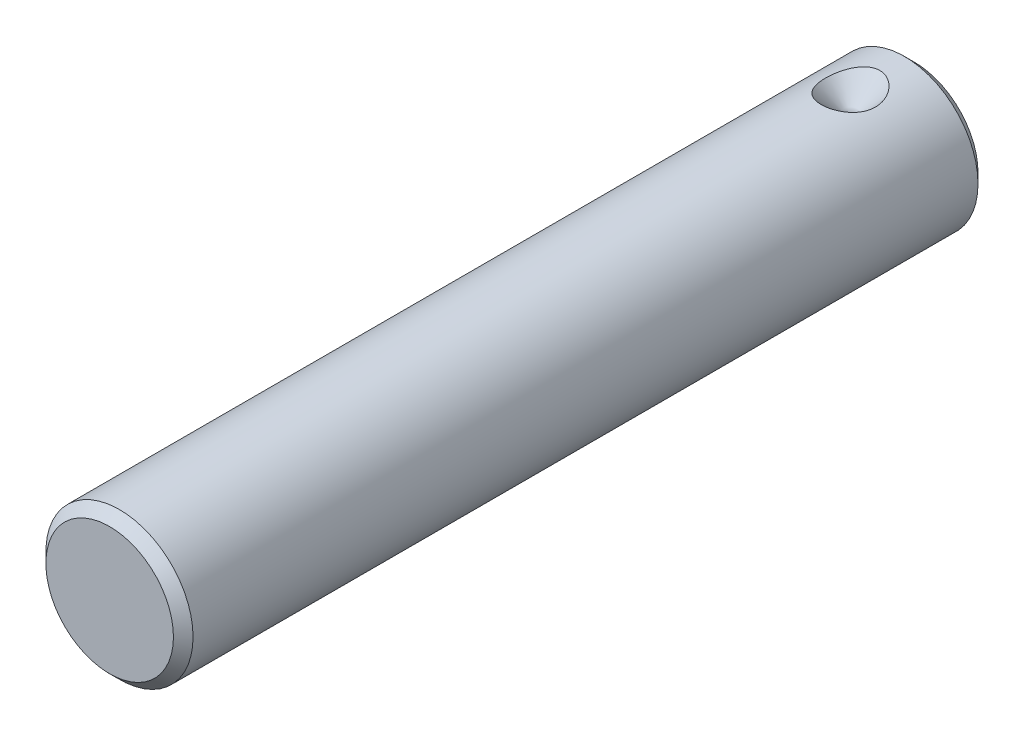
ISO-10303-21;
HEADER;
FILE_DESCRIPTION(('STEP AP214'),'2;1');
FILE_NAME('part.step','',(''),(''),'','','');
FILE_SCHEMA(('AUTOMOTIVE_DESIGN { 1 0 10303 214 1 1 1 1 }'));
ENDSEC;
DATA;
#1=APPLICATION_CONTEXT('core data for automotive mechanical design processes');
#2=APPLICATION_PROTOCOL_DEFINITION('international standard','automotive_design',2000,#1);
#3=PRODUCT_CONTEXT('',#1,'mechanical');
#4=PRODUCT('Part','Part','',(#3));
#5=PRODUCT_RELATED_PRODUCT_CATEGORY('part','',(#4));
#6=PRODUCT_DEFINITION_FORMATION('','',#4);
#7=PRODUCT_DEFINITION_CONTEXT('part definition',#1,'design');
#8=PRODUCT_DEFINITION('design','',#6,#7);
#9=PRODUCT_DEFINITION_SHAPE('','',#8);
#10=(LENGTH_UNIT() NAMED_UNIT(*) SI_UNIT(.MILLI.,.METRE.));
#11=(NAMED_UNIT(*) PLANE_ANGLE_UNIT() SI_UNIT($,.RADIAN.));
#12=(NAMED_UNIT(*) SI_UNIT($,.STERADIAN.) SOLID_ANGLE_UNIT());
#13=UNCERTAINTY_MEASURE_WITH_UNIT(LENGTH_MEASURE(1.E-05),#10,'distance_accuracy_value','');
#14=(GEOMETRIC_REPRESENTATION_CONTEXT(3) GLOBAL_UNCERTAINTY_ASSIGNED_CONTEXT((#13)) GLOBAL_UNIT_ASSIGNED_CONTEXT((#10,
#11,#12)) REPRESENTATION_CONTEXT('',''));
#15=CARTESIAN_POINT('',(0.,0.,0.));
#16=DIRECTION('',(0.,0.,1.));
#17=DIRECTION('',(1.,0.,0.));
#18=AXIS2_PLACEMENT_3D('',#15,#16,#17);
#19=CARTESIAN_POINT('',(0.,0.,82.));
#20=DIRECTION('',(0.,0.,-1.));
#21=DIRECTION('',(-1.,0.,0.));
#22=AXIS2_PLACEMENT_3D('',#19,#20,#21);
#23=CYLINDRICAL_SURFACE('',#22,7.5);
#24=CARTESIAN_POINT('',(0.,0.,81.));
#25=DIRECTION('',(0.,0.,1.));
#26=DIRECTION('',(1.,0.,0.));
#27=AXIS2_PLACEMENT_3D('',#24,#25,#26);
#28=CIRCLE('',#27,7.5);
#29=CARTESIAN_POINT('',(7.5,0.,81.));
#30=VERTEX_POINT('',#29);
#31=EDGE_CURVE('E49',#30,#30,#28,.F.);
#32=ORIENTED_EDGE('',*,*,#31,.T.);
#33=EDGE_LOOP('',(#32));
#34=FACE_BOUND('',#33,.T.);
#35=CARTESIAN_POINT('',(0.,0.,1.00000000000003));
#36=DIRECTION('',(0.,0.,1.));
#37=DIRECTION('',(1.,0.,0.));
#38=AXIS2_PLACEMENT_3D('',#35,#36,#37);
#39=CIRCLE('',#38,7.5);
#40=CARTESIAN_POINT('',(7.5,0.,1.00000000000003));
#41=VERTEX_POINT('',#40);
#42=EDGE_CURVE('E65',#41,#41,#39,.T.);
#43=ORIENTED_EDGE('',*,*,#42,.T.);
#44=EDGE_LOOP('',(#43));
#45=FACE_BOUND('',#44,.T.);
#46=CARTESIAN_POINT('',(-1.47707902909699,7.35311087601103,4.0590005879587));
#47=CARTESIAN_POINT('',(-1.5839328256194,7.33164667120942,4.14874921443851));
#48=CARTESIAN_POINT('',(-1.68352324734299,7.30921795473535,4.24692007223599));
#49=CARTESIAN_POINT('',(-1.86738415363234,7.26442458128592,4.45697146156353));
#50=CARTESIAN_POINT('',(-1.95161860031434,7.2420601932186,4.5688832372067));
#51=CARTESIAN_POINT('',(-2.1152247878205,7.1961157391603,4.82072235266105));
#52=CARTESIAN_POINT('',(-2.19206857483794,7.17283895915137,4.96235084194592));
#53=CARTESIAN_POINT('',(-2.32401608151441,7.13118073513076,5.25599420179921));
#54=CARTESIAN_POINT('',(-2.37911972856451,7.11279930746893,5.40800910705478));
#55=CARTESIAN_POINT('',(-2.47187373309358,7.08113938689317,5.73587758758487));
#56=CARTESIAN_POINT('',(-2.50698721092675,7.06862925418301,5.9125298060256));
#57=CARTESIAN_POINT('',(-2.54937168208692,7.0534539754866,6.26956350065951));
#58=CARTESIAN_POINT('',(-2.55663847760463,7.05079031383039,6.44994553499167));
#59=CARTESIAN_POINT('',(-2.54305972628458,7.05570033895164,6.81337824683152));
#60=CARTESIAN_POINT('',(-2.52161153200252,7.06349349282575,6.99640383043065));
#61=CARTESIAN_POINT('',(-2.44987667885987,7.08869026009067,7.35611323635118));
#62=CARTESIAN_POINT('',(-2.39957726294301,7.10609812466232,7.53279421655253));
#63=CARTESIAN_POINT('',(-2.27079854089685,7.14829031683831,7.87473309924741));
#64=CARTESIAN_POINT('',(-2.19230736509927,7.17307775073341,8.03998615520299));
#65=CARTESIAN_POINT('',(-2.00793372060204,7.22685193213562,8.35371616614124));
#66=CARTESIAN_POINT('',(-1.90206979718897,7.25583583067181,8.50220438197987));
#67=CARTESIAN_POINT('',(-1.68786218808685,7.30826365516269,8.74901362798377));
#68=CARTESIAN_POINT('',(-1.58422042015873,7.33166007495115,8.85143440105054));
#69=CARTESIAN_POINT('',(-1.3611649029259,7.37632093616283,9.03791654325617));
#70=CARTESIAN_POINT('',(-1.24177164064004,7.39758808486041,9.12200139026678));
#71=CARTESIAN_POINT('',(-1.00813520863509,7.4327283325386,9.2567505231733));
#72=CARTESIAN_POINT('',(-0.895789123729619,7.44723146681885,9.31053147355728));
#73=CARTESIAN_POINT('',(-0.663350189449545,7.47151796620175,9.39916899842798));
#74=CARTESIAN_POINT('',(-0.543261577029299,7.48130388827034,9.43403582660666));
#75=CARTESIAN_POINT('',(-0.298005133691314,7.49508654560496,9.48284791097122));
#76=CARTESIAN_POINT('',(-0.172818199734215,7.49905895409091,9.49670526116194));
#77=CARTESIAN_POINT('',(0.0780832391678082,7.50064188596071,9.50224760244724));
#78=CARTESIAN_POINT('',(0.203797659762059,7.49825339050643,9.49393601307411));
#79=CARTESIAN_POINT('',(0.442709220279822,7.4878101969206,9.45711964971857));
#80=CARTESIAN_POINT('',(0.55615922758477,7.48017221931012,9.43009896010601));
#81=CARTESIAN_POINT('',(0.777127900854823,7.46045512492648,9.35897684513193));
#82=CARTESIAN_POINT('',(0.884645499065353,7.44837521164347,9.31487235629712));
#83=CARTESIAN_POINT('',(1.09754094430353,7.42008043999124,9.2086909349686));
#84=CARTESIAN_POINT('',(1.20245230612844,7.4036700615479,9.14573720500599));
#85=CARTESIAN_POINT('',(1.40180793913712,7.36852776390022,9.00558265762189));
#86=CARTESIAN_POINT('',(1.49624735168006,7.34979477554801,8.92837527087564));
#87=CARTESIAN_POINT('',(1.68769937027426,7.30840049953437,8.749018226706));
#88=CARTESIAN_POINT('',(1.78279067066659,7.28558403515414,8.64485578394017));
#89=CARTESIAN_POINT('',(1.95701642005785,7.240731497048,8.42380570579143));
#90=CARTESIAN_POINT('',(2.03614044981169,7.21869594057442,8.30690983747098));
#91=CARTESIAN_POINT('',(2.18975373564369,7.17373179050396,8.04281038979401));
#92=CARTESIAN_POINT('',(2.26128286582492,7.15126432903633,7.89379978800494));
#93=CARTESIAN_POINT('',(2.3813595316026,7.11218096212165,7.58606470760648));
#94=CARTESIAN_POINT('',(2.42989793273174,7.09556738315618,7.42733639628138));
#95=CARTESIAN_POINT('',(2.50677767894322,7.06879821567171,7.08927866933224));
#96=CARTESIAN_POINT('',(2.53290147796754,7.05936058787964,6.90938269307804));
#97=CARTESIAN_POINT('',(2.55675222378239,7.05075724281847,6.54748647905903));
#98=CARTESIAN_POINT('',(2.55447814633962,7.05159189604228,6.3654861656331));
#99=CARTESIAN_POINT('',(2.52135894331537,7.0635020767204,6.00200298220532));
#100=CARTESIAN_POINT('',(2.49013622948599,7.07471294173772,5.82055881239887));
#101=CARTESIAN_POINT('',(2.39904529445963,7.10611580710497,5.46570533248325));
#102=CARTESIAN_POINT('',(2.33916131951874,7.12631274624588,5.2923004987822));
#103=CARTESIAN_POINT('',(2.19154575026068,7.17308211739379,4.95883076275272));
#104=CARTESIAN_POINT('',(2.10383493885111,7.19964978771644,4.79875601692379));
#105=CARTESIAN_POINT('',(1.90140500774026,7.25573166919009,4.49729475053969));
#106=CARTESIAN_POINT('',(1.78671613669458,7.28524255911779,4.35588757454206));
#107=CARTESIAN_POINT('',(1.56079833763191,7.33648940705849,4.12751329029175));
#108=CARTESIAN_POINT('',(1.45473201738479,7.35846517764632,4.0354826014292));
#109=CARTESIAN_POINT('',(1.22850073142113,7.39959235298263,3.86986445814121));
#110=CARTESIAN_POINT('',(1.10834433185379,7.41874545796581,3.79626588227799));
#111=CARTESIAN_POINT('',(0.855128586934648,7.45219178915853,3.67086149879204));
#112=CARTESIAN_POINT('',(0.72197112840568,7.46644369262184,3.61924015804343));
#113=CARTESIAN_POINT('',(0.447701872275129,7.48788227961751,3.54244989975568));
#114=CARTESIAN_POINT('',(0.306599441299024,7.49507710593771,3.51725049302277));
#115=CARTESIAN_POINT('',(0.0420867815793008,7.50088236758279,3.49690453574446));
#116=CARTESIAN_POINT('',(-0.0810243592926614,7.50055671626989,3.49803358221662));
#117=CARTESIAN_POINT('',(-0.325102956936017,7.49394429581899,3.5212387877133));
#118=CARTESIAN_POINT('',(-0.446070195824481,7.48765692429534,3.54331706349529));
#119=CARTESIAN_POINT('',(-0.676793917568801,7.4702574509108,3.60553350341213));
#120=CARTESIAN_POINT('',(-0.786810138597894,7.45938146634656,3.64479093917722));
#121=CARTESIAN_POINT('',(-0.999229592428384,7.43390769610132,3.7390787882294));
#122=CARTESIAN_POINT('',(-1.10163886181526,7.41931290317107,3.79409652265013));
#123=CARTESIAN_POINT('',(-1.29664679557317,7.38772009435093,3.91724970950402));
#124=CARTESIAN_POINT('',(-1.38931299903704,7.37074083493754,3.98528415573241));
#125=CARTESIAN_POINT('',(-1.47707902909699,7.35311087601103,4.0590005879587));
#126=B_SPLINE_CURVE_WITH_KNOTS('',3,(#46,#47,#48,#49,#50,#51,#52,#53,#54,#55,#56,#57,#58,#59,
#60,#61,#62,#63,#64,#65,#66,#67,#68,#69,#70,#71,#72,#73,#74,#75,#76,#77,#78,#79,#80,#81,#82,#83,
#84,#85,#86,#87,#88,#89,#90,#91,#92,#93,#94,#95,#96,#97,#98,#99,#100,#101,#102,#103,#104,#105,
#106,#107,#108,#109,#110,#111,#112,#113,#114,#115,#116,#117,#118,#119,#120,#121,#122,#123,#124,
#125),.UNSPECIFIED.,.T.,.F.,(4,2,2,2,2,2,2,2,2,2,2,2,2,2,2,2,2,2,2,2,2,2,2,2,2,2,2,2,2,2,2,2,2,
2,2,2,2,2,2,4),(0.,0.423202686522097,0.847386119755746,1.33382299561528,1.82026149608995,
2.359387638127,2.89859504872214,3.44929815715319,4.00024495620769,4.55142399462757,
5.10223057825516,5.54322770543553,5.98365680711813,6.35826260383001,6.73266511641345,
7.10862988901607,7.48453667285808,7.83360513932451,8.18273622987919,8.55165096910118,
8.92073616272594,9.3477331020993,9.77500777842934,10.2733538781466,10.7718978104633,
11.3154252341155,11.8589722613637,12.4097102502906,12.9607513021787,13.5113817654819,
14.0613977627633,14.486128553066,14.9106024515237,15.3385721199243,15.766047393823,
16.1334731979299,16.5009361315244,16.8514362313417,17.2016551484553,17.5492592665641),.UNSPECIFIED.);
#127=CARTESIAN_POINT('',(-1.47707902909699,7.35311087601103,4.0590005879587));
#128=VERTEX_POINT('',#127);
#129=EDGE_CURVE('E60',#128,#128,#126,.T.);
#130=ORIENTED_EDGE('',*,*,#129,.F.);
#131=EDGE_LOOP('',(#130));
#132=FACE_BOUND('',#131,.T.);
#133=ADVANCED_FACE('F41',(#34,#45,#132),#23,.T.);
#134=CARTESIAN_POINT('',(0.,0.,82.));
#135=DIRECTION('',(0.,0.,1.));
#136=DIRECTION('',(1.,0.,0.));
#137=AXIS2_PLACEMENT_3D('',#134,#135,#136);
#138=PLANE('',#137);
#139=CARTESIAN_POINT('',(0.,0.,82.));
#140=DIRECTION('',(0.,0.,1.));
#141=DIRECTION('',(1.,0.,0.));
#142=AXIS2_PLACEMENT_3D('',#139,#140,#141);
#143=CIRCLE('',#142,6.5);
#144=CARTESIAN_POINT('',(6.5,0.,82.));
#145=VERTEX_POINT('',#144);
#146=EDGE_CURVE('E62',#145,#145,#143,.T.);
#147=ORIENTED_EDGE('',*,*,#146,.T.);
#148=EDGE_LOOP('',(#147));
#149=FACE_BOUND('',#148,.T.);
#150=ADVANCED_FACE('F76',(#149),#138,.T.);
#151=CARTESIAN_POINT('',(0.,0.,0.));
#152=DIRECTION('',(0.,0.,1.));
#153=DIRECTION('',(1.,0.,0.));
#154=AXIS2_PLACEMENT_3D('',#151,#152,#153);
#155=PLANE('',#154);
#156=CARTESIAN_POINT('',(0.,0.,0.));
#157=DIRECTION('',(0.,0.,1.));
#158=DIRECTION('',(1.,0.,0.));
#159=AXIS2_PLACEMENT_3D('',#156,#157,#158);
#160=CIRCLE('',#159,6.49999999999997);
#161=CARTESIAN_POINT('',(6.49999999999997,0.,0.));
#162=VERTEX_POINT('',#161);
#163=EDGE_CURVE('E11',#162,#162,#160,.F.);
#164=ORIENTED_EDGE('',*,*,#163,.T.);
#165=EDGE_LOOP('',(#164));
#166=FACE_BOUND('',#165,.T.);
#167=ADVANCED_FACE('F56',(#166),#155,.F.);
#168=CARTESIAN_POINT('',(0.,4.5,6.5));
#169=DIRECTION('',(0.,1.,0.));
#170=DIRECTION('',(0.,0.,1.));
#171=AXIS2_PLACEMENT_3D('',#168,#169,#170);
#172=CONICAL_SURFACE('',#171,0.,0.785398163397447);
#173=CARTESIAN_POINT('',(0.,4.5,6.5));
#174=VERTEX_POINT('',#173);
#175=VERTEX_LOOP('',#174);
#176=FACE_BOUND('',#175,.T.);
#177=ORIENTED_EDGE('',*,*,#129,.T.);
#178=EDGE_LOOP('',(#177));
#179=FACE_BOUND('',#178,.T.);
#180=ADVANCED_FACE('F52',(#176,#179),#172,.F.);
#181=CARTESIAN_POINT('',(0.,0.,82.));
#182=DIRECTION('',(0.,0.,-1.));
#183=DIRECTION('',(-1.,0.,0.));
#184=AXIS2_PLACEMENT_3D('',#181,#182,#183);
#185=CONICAL_SURFACE('',#184,6.5,0.785398163397449);
#186=ORIENTED_EDGE('',*,*,#31,.F.);
#187=EDGE_LOOP('',(#186));
#188=FACE_BOUND('',#187,.T.);
#189=ORIENTED_EDGE('',*,*,#146,.F.);
#190=EDGE_LOOP('',(#189));
#191=FACE_BOUND('',#190,.T.);
#192=ADVANCED_FACE('F55',(#188,#191),#185,.T.);
#193=CARTESIAN_POINT('',(0.,0.,1.00000000000003));
#194=DIRECTION('',(0.,0.,1.));
#195=DIRECTION('',(1.,0.,0.));
#196=AXIS2_PLACEMENT_3D('',#193,#194,#195);
#197=CONICAL_SURFACE('',#196,7.5,0.785398163397448);
#198=ORIENTED_EDGE('',*,*,#163,.F.);
#199=EDGE_LOOP('',(#198));
#200=FACE_BOUND('',#199,.T.);
#201=ORIENTED_EDGE('',*,*,#42,.F.);
#202=EDGE_LOOP('',(#201));
#203=FACE_BOUND('',#202,.T.);
#204=ADVANCED_FACE('F44',(#200,#203),#197,.T.);
#205=CLOSED_SHELL('',(#133,#150,#167,#180,#192,#204));
#206=MANIFOLD_SOLID_BREP('B2',#205);
#207=ADVANCED_BREP_SHAPE_REPRESENTATION('',(#18,#206),#14);
#208=SHAPE_DEFINITION_REPRESENTATION(#9,#207);
ENDSEC;
END-ISO-10303-21;
